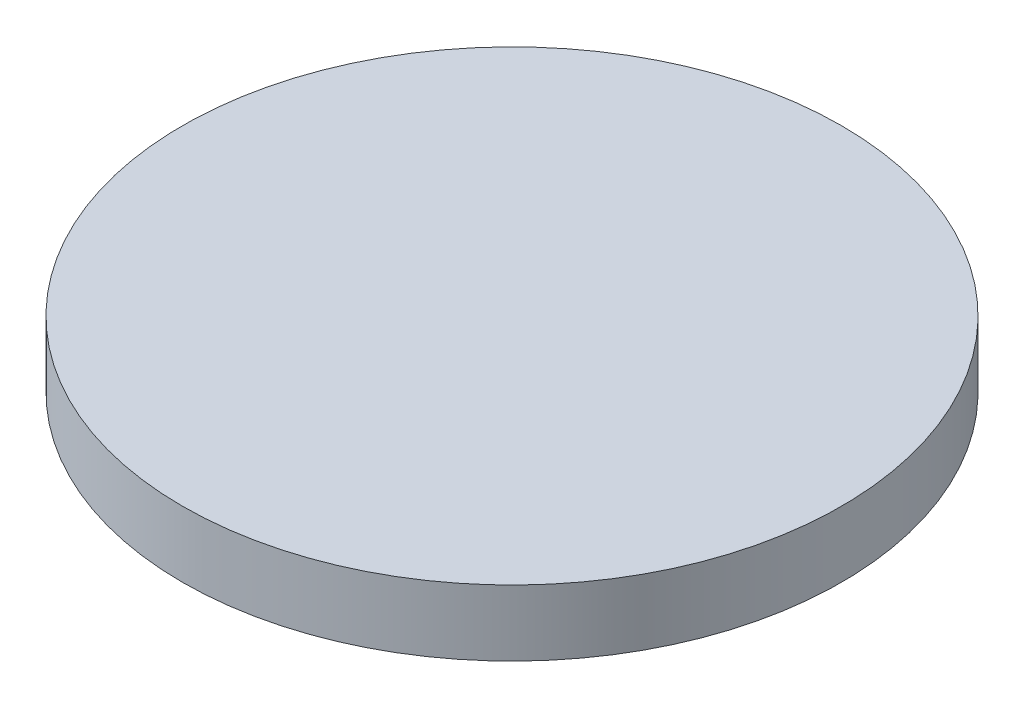
ISO-10303-21;
HEADER;
FILE_DESCRIPTION(('STEP AP214'),'2;1');
FILE_NAME('part.step','',(''),(''),'','','');
FILE_SCHEMA(('AUTOMOTIVE_DESIGN { 1 0 10303 214 1 1 1 1 }'));
ENDSEC;
DATA;
#1=APPLICATION_CONTEXT('core data for automotive mechanical design processes');
#2=APPLICATION_PROTOCOL_DEFINITION('international standard','automotive_design',2000,#1);
#3=PRODUCT_CONTEXT('',#1,'mechanical');
#4=PRODUCT('Part','Part','',(#3));
#5=PRODUCT_RELATED_PRODUCT_CATEGORY('part','',(#4));
#6=PRODUCT_DEFINITION_FORMATION('','',#4);
#7=PRODUCT_DEFINITION_CONTEXT('part definition',#1,'design');
#8=PRODUCT_DEFINITION('design','',#6,#7);
#9=PRODUCT_DEFINITION_SHAPE('','',#8);
#10=(LENGTH_UNIT() NAMED_UNIT(*) SI_UNIT(.MILLI.,.METRE.));
#11=(NAMED_UNIT(*) PLANE_ANGLE_UNIT() SI_UNIT($,.RADIAN.));
#12=(NAMED_UNIT(*) SI_UNIT($,.STERADIAN.) SOLID_ANGLE_UNIT());
#13=UNCERTAINTY_MEASURE_WITH_UNIT(LENGTH_MEASURE(1.E-05),#10,'distance_accuracy_value','');
#14=(GEOMETRIC_REPRESENTATION_CONTEXT(3) GLOBAL_UNCERTAINTY_ASSIGNED_CONTEXT((#13)) GLOBAL_UNIT_ASSIGNED_CONTEXT((#10,
#11,#12)) REPRESENTATION_CONTEXT('',''));
#15=CARTESIAN_POINT('',(0.,0.,0.));
#16=DIRECTION('',(0.,0.,1.));
#17=DIRECTION('',(1.,0.,0.));
#18=AXIS2_PLACEMENT_3D('',#15,#16,#17);
#19=CARTESIAN_POINT('',(0.,3.175,0.));
#20=DIRECTION('',(0.,-1.,0.));
#21=DIRECTION('',(0.,0.,-1.));
#22=AXIS2_PLACEMENT_3D('',#19,#20,#21);
#23=CYLINDRICAL_SURFACE('',#22,31.75);
#24=CARTESIAN_POINT('',(0.,3.175,0.));
#25=DIRECTION('',(0.,1.,0.));
#26=DIRECTION('',(0.,0.,1.));
#27=AXIS2_PLACEMENT_3D('',#24,#25,#26);
#28=CIRCLE('',#27,31.75);
#29=CARTESIAN_POINT('',(0.,3.175,31.75));
#30=VERTEX_POINT('',#29);
#31=EDGE_CURVE('E10',#30,#30,#28,.T.);
#32=ORIENTED_EDGE('',*,*,#31,.F.);
#33=EDGE_LOOP('',(#32));
#34=FACE_BOUND('',#33,.T.);
#35=CARTESIAN_POINT('',(0.,-3.175,0.));
#36=DIRECTION('',(0.,1.,0.));
#37=DIRECTION('',(0.,0.,1.));
#38=AXIS2_PLACEMENT_3D('',#35,#36,#37);
#39=CIRCLE('',#38,31.75);
#40=CARTESIAN_POINT('',(0.,-3.175,31.75));
#41=VERTEX_POINT('',#40);
#42=EDGE_CURVE('E48',#41,#41,#39,.T.);
#43=ORIENTED_EDGE('',*,*,#42,.T.);
#44=EDGE_LOOP('',(#43));
#45=FACE_BOUND('',#44,.T.);
#46=ADVANCED_FACE('F41',(#34,#45),#23,.T.);
#47=CARTESIAN_POINT('',(0.,3.175,0.));
#48=DIRECTION('',(0.,1.,0.));
#49=DIRECTION('',(0.,0.,1.));
#50=AXIS2_PLACEMENT_3D('',#47,#48,#49);
#51=PLANE('',#50);
#52=ORIENTED_EDGE('',*,*,#31,.T.);
#53=EDGE_LOOP('',(#52));
#54=FACE_BOUND('',#53,.T.);
#55=ADVANCED_FACE('F58',(#54),#51,.T.);
#56=CARTESIAN_POINT('',(0.,-3.175,0.));
#57=DIRECTION('',(0.,1.,0.));
#58=DIRECTION('',(0.,0.,1.));
#59=AXIS2_PLACEMENT_3D('',#56,#57,#58);
#60=PLANE('',#59);
#61=ORIENTED_EDGE('',*,*,#42,.F.);
#62=EDGE_LOOP('',(#61));
#63=FACE_BOUND('',#62,.T.);
#64=ADVANCED_FACE('F56',(#63),#60,.F.);
#65=CLOSED_SHELL('',(#46,#55,#64));
#66=MANIFOLD_SOLID_BREP('B2',#65);
#67=ADVANCED_BREP_SHAPE_REPRESENTATION('',(#18,#66),#14);
#68=SHAPE_DEFINITION_REPRESENTATION(#9,#67);
ENDSEC;
END-ISO-10303-21;
